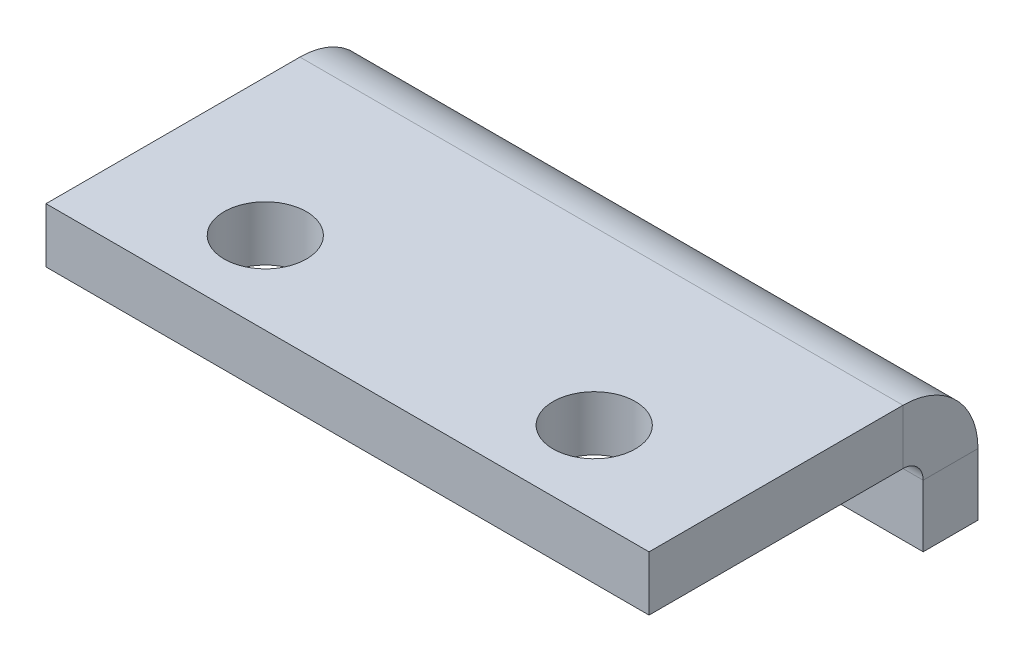
ISO-10303-21;
HEADER;
FILE_DESCRIPTION(('STEP AP214'),'2;1');
FILE_NAME('part.step','',(''),(''),'','','');
FILE_SCHEMA(('AUTOMOTIVE_DESIGN { 1 0 10303 214 1 1 1 1 }'));
ENDSEC;
DATA;
#1=APPLICATION_CONTEXT('core data for automotive mechanical design processes');
#2=APPLICATION_PROTOCOL_DEFINITION('international standard','automotive_design',2000,#1);
#3=PRODUCT_CONTEXT('',#1,'mechanical');
#4=PRODUCT('Part','Part','',(#3));
#5=PRODUCT_RELATED_PRODUCT_CATEGORY('part','',(#4));
#6=PRODUCT_DEFINITION_FORMATION('','',#4);
#7=PRODUCT_DEFINITION_CONTEXT('part definition',#1,'design');
#8=PRODUCT_DEFINITION('design','',#6,#7);
#9=PRODUCT_DEFINITION_SHAPE('','',#8);
#10=(LENGTH_UNIT() NAMED_UNIT(*) SI_UNIT(.MILLI.,.METRE.));
#11=(NAMED_UNIT(*) PLANE_ANGLE_UNIT() SI_UNIT($,.RADIAN.));
#12=(NAMED_UNIT(*) SI_UNIT($,.STERADIAN.) SOLID_ANGLE_UNIT());
#13=UNCERTAINTY_MEASURE_WITH_UNIT(LENGTH_MEASURE(1.E-05),#10,'distance_accuracy_value','');
#14=(GEOMETRIC_REPRESENTATION_CONTEXT(3) GLOBAL_UNCERTAINTY_ASSIGNED_CONTEXT((#13)) GLOBAL_UNIT_ASSIGNED_CONTEXT((#10,
#11,#12)) REPRESENTATION_CONTEXT('',''));
#15=CARTESIAN_POINT('',(0.,0.,0.));
#16=DIRECTION('',(0.,0.,1.));
#17=DIRECTION('',(1.,0.,0.));
#18=AXIS2_PLACEMENT_3D('',#15,#16,#17);
#19=CARTESIAN_POINT('',(11.,-2.,0.));
#20=DIRECTION('',(0.,1.,0.));
#21=DIRECTION('',(0.,0.,1.));
#22=AXIS2_PLACEMENT_3D('',#19,#20,#21);
#23=PLANE('',#22);
#24=CARTESIAN_POINT('',(-6.,-2.,-3.));
#25=DIRECTION('',(0.,1.,0.));
#26=DIRECTION('',(0.,0.,1.));
#27=AXIS2_PLACEMENT_3D('',#24,#25,#26);
#28=CIRCLE('',#27,1.5);
#29=CARTESIAN_POINT('',(-6.,-2.,-1.5));
#30=VERTEX_POINT('',#29);
#31=EDGE_CURVE('E195',#30,#30,#28,.T.);
#32=ORIENTED_EDGE('',*,*,#31,.T.);
#33=EDGE_LOOP('',(#32));
#34=FACE_BOUND('',#33,.T.);
#35=CARTESIAN_POINT('',(6.,-2.,-3.));
#36=DIRECTION('',(0.,1.,0.));
#37=DIRECTION('',(0.,0.,1.));
#38=AXIS2_PLACEMENT_3D('',#35,#36,#37);
#39=CIRCLE('',#38,1.5);
#40=CARTESIAN_POINT('',(6.,-2.,-1.5));
#41=VERTEX_POINT('',#40);
#42=EDGE_CURVE('E189',#41,#41,#39,.T.);
#43=ORIENTED_EDGE('',*,*,#42,.T.);
#44=EDGE_LOOP('',(#43));
#45=FACE_BOUND('',#44,.T.);
#46=DIRECTION('',(1.,0.,0.));
#47=VECTOR('',#46,1.);
#48=CARTESIAN_POINT('',(11.,-2.,-9.2634));
#49=LINE('',#48,#47);
#50=CARTESIAN_POINT('',(11.,-2.,-9.2634));
#51=VERTEX_POINT('',#50);
#52=CARTESIAN_POINT('',(-11.,-2.,-9.2634));
#53=VERTEX_POINT('',#52);
#54=EDGE_CURVE('E180',#51,#53,#49,.F.);
#55=ORIENTED_EDGE('',*,*,#54,.F.);
#56=DIRECTION('',(0.,0.,-1.));
#57=VECTOR('',#56,1.);
#58=CARTESIAN_POINT('',(11.,-2.,0.));
#59=LINE('',#58,#57);
#60=CARTESIAN_POINT('',(11.,-2.,0.));
#61=VERTEX_POINT('',#60);
#62=EDGE_CURVE('E199',#61,#51,#59,.T.);
#63=ORIENTED_EDGE('',*,*,#62,.F.);
#64=DIRECTION('',(-1.,0.,0.));
#65=VECTOR('',#64,1.);
#66=CARTESIAN_POINT('',(11.,-2.,0.));
#67=LINE('',#66,#65);
#68=CARTESIAN_POINT('',(-11.,-2.,0.));
#69=VERTEX_POINT('',#68);
#70=EDGE_CURVE('E67',#61,#69,#67,.T.);
#71=ORIENTED_EDGE('',*,*,#70,.T.);
#72=DIRECTION('',(0.,0.,-1.));
#73=VECTOR('',#72,1.);
#74=CARTESIAN_POINT('',(-11.,-2.,0.));
#75=LINE('',#74,#73);
#76=EDGE_CURVE('E198',#69,#53,#75,.T.);
#77=ORIENTED_EDGE('',*,*,#76,.T.);
#78=EDGE_LOOP('',(#55,#63,#71,#77));
#79=FACE_BOUND('',#78,.T.);
#80=ADVANCED_FACE('F59',(#34,#45,#79),#23,.F.);
#81=CARTESIAN_POINT('',(11.,0.,0.));
#82=DIRECTION('',(0.,1.,0.));
#83=DIRECTION('',(0.,0.,1.));
#84=AXIS2_PLACEMENT_3D('',#81,#82,#83);
#85=PLANE('',#84);
#86=CARTESIAN_POINT('',(6.,0.,-3.));
#87=DIRECTION('',(0.,1.,0.));
#88=DIRECTION('',(0.,0.,1.));
#89=AXIS2_PLACEMENT_3D('',#86,#87,#88);
#90=CIRCLE('',#89,1.5);
#91=CARTESIAN_POINT('',(6.,0.,-1.5));
#92=VERTEX_POINT('',#91);
#93=EDGE_CURVE('E185',#92,#92,#90,.T.);
#94=ORIENTED_EDGE('',*,*,#93,.F.);
#95=EDGE_LOOP('',(#94));
#96=FACE_BOUND('',#95,.T.);
#97=CARTESIAN_POINT('',(-6.,0.,-3.));
#98=DIRECTION('',(0.,1.,0.));
#99=DIRECTION('',(0.,0.,1.));
#100=AXIS2_PLACEMENT_3D('',#97,#98,#99);
#101=CIRCLE('',#100,1.5);
#102=CARTESIAN_POINT('',(-6.,0.,-1.5));
#103=VERTEX_POINT('',#102);
#104=EDGE_CURVE('E192',#103,#103,#101,.T.);
#105=ORIENTED_EDGE('',*,*,#104,.F.);
#106=EDGE_LOOP('',(#105));
#107=FACE_BOUND('',#106,.T.);
#108=DIRECTION('',(0.,0.,-1.));
#109=VECTOR('',#108,1.);
#110=CARTESIAN_POINT('',(11.,0.,0.));
#111=LINE('',#110,#109);
#112=CARTESIAN_POINT('',(11.,0.,0.));
#113=VERTEX_POINT('',#112);
#114=CARTESIAN_POINT('',(11.,0.,-9.2634));
#115=VERTEX_POINT('',#114);
#116=EDGE_CURVE('E202',#113,#115,#111,.T.);
#117=ORIENTED_EDGE('',*,*,#116,.T.);
#118=DIRECTION('',(1.,0.,0.));
#119=VECTOR('',#118,1.);
#120=CARTESIAN_POINT('',(11.,0.,-9.2634));
#121=LINE('',#120,#119);
#122=CARTESIAN_POINT('',(-11.,0.,-9.2634));
#123=VERTEX_POINT('',#122);
#124=EDGE_CURVE('E127',#115,#123,#121,.F.);
#125=ORIENTED_EDGE('',*,*,#124,.T.);
#126=DIRECTION('',(0.,0.,-1.));
#127=VECTOR('',#126,1.);
#128=CARTESIAN_POINT('',(-11.,0.,0.));
#129=LINE('',#128,#127);
#130=CARTESIAN_POINT('',(-11.,0.,0.));
#131=VERTEX_POINT('',#130);
#132=EDGE_CURVE('E210',#131,#123,#129,.T.);
#133=ORIENTED_EDGE('',*,*,#132,.F.);
#134=DIRECTION('',(-1.,0.,0.));
#135=VECTOR('',#134,1.);
#136=CARTESIAN_POINT('',(11.,0.,0.));
#137=LINE('',#136,#135);
#138=EDGE_CURVE('E13',#113,#131,#137,.T.);
#139=ORIENTED_EDGE('',*,*,#138,.F.);
#140=EDGE_LOOP('',(#117,#125,#133,#139));
#141=FACE_BOUND('',#140,.T.);
#142=ADVANCED_FACE('F232',(#96,#107,#141),#85,.T.);
#143=CARTESIAN_POINT('',(11.,-2.,-12.));
#144=DIRECTION('',(-1.,0.,0.));
#145=DIRECTION('',(0.,0.,1.));
#146=AXIS2_PLACEMENT_3D('',#143,#144,#145);
#147=PLANE('',#146);
#148=DIRECTION('',(0.,1.,0.));
#149=VECTOR('',#148,1.);
#150=CARTESIAN_POINT('',(11.,-2.,-9.2634));
#151=LINE('',#150,#149);
#152=EDGE_CURVE('E176',#51,#115,#151,.T.);
#153=ORIENTED_EDGE('',*,*,#152,.T.);
#154=ORIENTED_EDGE('',*,*,#116,.F.);
#155=DIRECTION('',(0.,1.,0.));
#156=VECTOR('',#155,1.);
#157=CARTESIAN_POINT('',(11.,-2.,0.));
#158=LINE('',#157,#156);
#159=EDGE_CURVE('E206',#61,#113,#158,.T.);
#160=ORIENTED_EDGE('',*,*,#159,.F.);
#161=ORIENTED_EDGE('',*,*,#62,.T.);
#162=EDGE_LOOP('',(#153,#154,#160,#161));
#163=FACE_BOUND('',#162,.T.);
#164=ADVANCED_FACE('F223',(#163),#147,.F.);
#165=CARTESIAN_POINT('',(11.,-2.,0.));
#166=DIRECTION('',(0.,0.,1.));
#167=DIRECTION('',(1.,0.,0.));
#168=AXIS2_PLACEMENT_3D('',#165,#166,#167);
#169=PLANE('',#168);
#170=DIRECTION('',(0.,1.,0.));
#171=VECTOR('',#170,1.);
#172=CARTESIAN_POINT('',(-11.,-2.,0.));
#173=LINE('',#172,#171);
#174=EDGE_CURVE('E203',#69,#131,#173,.T.);
#175=ORIENTED_EDGE('',*,*,#174,.F.);
#176=ORIENTED_EDGE('',*,*,#70,.F.);
#177=ORIENTED_EDGE('',*,*,#159,.T.);
#178=ORIENTED_EDGE('',*,*,#138,.T.);
#179=EDGE_LOOP('',(#175,#176,#177,#178));
#180=FACE_BOUND('',#179,.T.);
#181=ADVANCED_FACE('F221',(#180),#169,.T.);
#182=CARTESIAN_POINT('',(-11.,-2.,-12.));
#183=DIRECTION('',(-1.,0.,0.));
#184=DIRECTION('',(0.,0.,1.));
#185=AXIS2_PLACEMENT_3D('',#182,#183,#184);
#186=PLANE('',#185);
#187=DIRECTION('',(0.,1.,0.));
#188=VECTOR('',#187,1.);
#189=CARTESIAN_POINT('',(-11.,-2.,-9.2634));
#190=LINE('',#189,#188);
#191=EDGE_CURVE('E183',#53,#123,#190,.T.);
#192=ORIENTED_EDGE('',*,*,#191,.F.);
#193=ORIENTED_EDGE('',*,*,#76,.F.);
#194=ORIENTED_EDGE('',*,*,#174,.T.);
#195=ORIENTED_EDGE('',*,*,#132,.T.);
#196=EDGE_LOOP('',(#192,#193,#194,#195));
#197=FACE_BOUND('',#196,.T.);
#198=ADVANCED_FACE('F220',(#197),#186,.T.);
#199=CARTESIAN_POINT('',(-6.,-10.,-3.));
#200=DIRECTION('',(0.,1.,0.));
#201=DIRECTION('',(0.,0.,1.));
#202=AXIS2_PLACEMENT_3D('',#199,#200,#201);
#203=CYLINDRICAL_SURFACE('',#202,1.5);
#204=ORIENTED_EDGE('',*,*,#104,.T.);
#205=EDGE_LOOP('',(#204));
#206=FACE_BOUND('',#205,.T.);
#207=ORIENTED_EDGE('',*,*,#31,.F.);
#208=EDGE_LOOP('',(#207));
#209=FACE_BOUND('',#208,.T.);
#210=ADVANCED_FACE('F229',(#206,#209),#203,.F.);
#211=CARTESIAN_POINT('',(6.,-10.,-3.));
#212=DIRECTION('',(0.,1.,0.));
#213=DIRECTION('',(0.,0.,1.));
#214=AXIS2_PLACEMENT_3D('',#211,#212,#213);
#215=CYLINDRICAL_SURFACE('',#214,1.5);
#216=ORIENTED_EDGE('',*,*,#93,.T.);
#217=EDGE_LOOP('',(#216));
#218=FACE_BOUND('',#217,.T.);
#219=ORIENTED_EDGE('',*,*,#42,.F.);
#220=EDGE_LOOP('',(#219));
#221=FACE_BOUND('',#220,.T.);
#222=ADVANCED_FACE('F246',(#218,#221),#215,.F.);
#223=CARTESIAN_POINT('',(-11.,-2.7366,-9.2634));
#224=DIRECTION('',(-1.,0.,0.));
#225=DIRECTION('',(0.,0.,1.));
#226=AXIS2_PLACEMENT_3D('',#223,#224,#225);
#227=PLANE('',#226);
#228=DIRECTION('',(0.,0.,-1.));
#229=VECTOR('',#228,1.);
#230=CARTESIAN_POINT('',(-11.,-2.73659999999998,-12.));
#231=LINE('',#230,#229);
#232=CARTESIAN_POINT('',(-11.,-2.7366,-10.));
#233=VERTEX_POINT('',#232);
#234=CARTESIAN_POINT('',(-11.,-2.73659999999999,-12.));
#235=VERTEX_POINT('',#234);
#236=EDGE_CURVE('E172',#233,#235,#231,.T.);
#237=ORIENTED_EDGE('',*,*,#236,.F.);
#238=CARTESIAN_POINT('',(-11.,-2.7366,-9.2634));
#239=DIRECTION('',(1.,0.,0.));
#240=DIRECTION('',(0.,0.,-1.));
#241=AXIS2_PLACEMENT_3D('',#238,#239,#240);
#242=CIRCLE('',#241,0.7366);
#243=EDGE_CURVE('E130',#53,#233,#242,.F.);
#244=ORIENTED_EDGE('',*,*,#243,.F.);
#245=ORIENTED_EDGE('',*,*,#191,.T.);
#246=CARTESIAN_POINT('',(-11.,-2.7366,-9.2634));
#247=DIRECTION('',(1.,0.,0.));
#248=DIRECTION('',(0.,0.,-1.));
#249=AXIS2_PLACEMENT_3D('',#246,#247,#248);
#250=CIRCLE('',#249,2.7366);
#251=EDGE_CURVE('E88',#123,#235,#250,.F.);
#252=ORIENTED_EDGE('',*,*,#251,.T.);
#253=EDGE_LOOP('',(#237,#244,#245,#252));
#254=FACE_BOUND('',#253,.T.);
#255=ADVANCED_FACE('F248',(#254),#227,.T.);
#256=CARTESIAN_POINT('',(11.,-2.7366,-9.2634));
#257=DIRECTION('',(-1.,0.,0.));
#258=DIRECTION('',(0.,0.,1.));
#259=AXIS2_PLACEMENT_3D('',#256,#257,#258);
#260=PLANE('',#259);
#261=CARTESIAN_POINT('',(11.,-2.7366,-9.2634));
#262=DIRECTION('',(1.,0.,0.));
#263=DIRECTION('',(0.,0.,-1.));
#264=AXIS2_PLACEMENT_3D('',#261,#262,#263);
#265=CIRCLE('',#264,0.7366);
#266=CARTESIAN_POINT('',(11.,-2.7366,-10.));
#267=VERTEX_POINT('',#266);
#268=EDGE_CURVE('E137',#267,#51,#265,.T.);
#269=ORIENTED_EDGE('',*,*,#268,.F.);
#270=DIRECTION('',(0.,0.,-1.));
#271=VECTOR('',#270,1.);
#272=CARTESIAN_POINT('',(11.,-2.7366,-10.));
#273=LINE('',#272,#271);
#274=CARTESIAN_POINT('',(11.,-2.73659999999998,-12.));
#275=VERTEX_POINT('',#274);
#276=EDGE_CURVE('E134',#267,#275,#273,.T.);
#277=ORIENTED_EDGE('',*,*,#276,.T.);
#278=CARTESIAN_POINT('',(11.,-2.7366,-9.2634));
#279=DIRECTION('',(1.,0.,0.));
#280=DIRECTION('',(0.,0.,-1.));
#281=AXIS2_PLACEMENT_3D('',#278,#279,#280);
#282=CIRCLE('',#281,2.7366);
#283=EDGE_CURVE('E121',#275,#115,#282,.T.);
#284=ORIENTED_EDGE('',*,*,#283,.T.);
#285=ORIENTED_EDGE('',*,*,#152,.F.);
#286=EDGE_LOOP('',(#269,#277,#284,#285));
#287=FACE_BOUND('',#286,.T.);
#288=ADVANCED_FACE('F135',(#287),#260,.F.);
#289=CARTESIAN_POINT('',(11.,-2.7366,-9.2634));
#290=DIRECTION('',(1.,0.,0.));
#291=DIRECTION('',(0.,0.,-1.));
#292=AXIS2_PLACEMENT_3D('',#289,#290,#291);
#293=CYLINDRICAL_SURFACE('',#292,2.7366);
#294=ORIENTED_EDGE('',*,*,#124,.F.);
#295=ORIENTED_EDGE('',*,*,#283,.F.);
#296=DIRECTION('',(1.,0.,0.));
#297=VECTOR('',#296,1.);
#298=CARTESIAN_POINT('',(0.,-2.73659999999998,-12.));
#299=LINE('',#298,#297);
#300=EDGE_CURVE('E125',#235,#275,#299,.T.);
#301=ORIENTED_EDGE('',*,*,#300,.F.);
#302=ORIENTED_EDGE('',*,*,#251,.F.);
#303=EDGE_LOOP('',(#294,#295,#301,#302));
#304=FACE_BOUND('',#303,.T.);
#305=ADVANCED_FACE('F123',(#304),#293,.T.);
#306=CARTESIAN_POINT('',(11.,-2.7366,-9.2634));
#307=DIRECTION('',(1.,0.,0.));
#308=DIRECTION('',(0.,0.,-1.));
#309=AXIS2_PLACEMENT_3D('',#306,#307,#308);
#310=CYLINDRICAL_SURFACE('',#309,0.7366);
#311=ORIENTED_EDGE('',*,*,#54,.T.);
#312=ORIENTED_EDGE('',*,*,#243,.T.);
#313=DIRECTION('',(-1.,0.,0.));
#314=VECTOR('',#313,1.);
#315=CARTESIAN_POINT('',(-11.,-2.7366,-10.));
#316=LINE('',#315,#314);
#317=EDGE_CURVE('E142',#233,#267,#316,.F.);
#318=ORIENTED_EDGE('',*,*,#317,.T.);
#319=ORIENTED_EDGE('',*,*,#268,.T.);
#320=EDGE_LOOP('',(#311,#312,#318,#319));
#321=FACE_BOUND('',#320,.T.);
#322=ADVANCED_FACE('F262',(#321),#310,.F.);
#323=CARTESIAN_POINT('',(11.,-1.99999999999999,-12.));
#324=DIRECTION('',(1.,0.,0.));
#325=DIRECTION('',(0.,0.,-1.));
#326=AXIS2_PLACEMENT_3D('',#323,#324,#325);
#327=PLANE('',#326);
#328=DIRECTION('',(0.,1.,0.));
#329=VECTOR('',#328,1.);
#330=CARTESIAN_POINT('',(11.,-1.99999999999999,-12.));
#331=LINE('',#330,#329);
#332=CARTESIAN_POINT('',(11.,-5.,-12.));
#333=VERTEX_POINT('',#332);
#334=EDGE_CURVE('E149',#333,#275,#331,.T.);
#335=ORIENTED_EDGE('',*,*,#334,.T.);
#336=ORIENTED_EDGE('',*,*,#276,.F.);
#337=DIRECTION('',(0.,-1.,0.));
#338=VECTOR('',#337,1.);
#339=CARTESIAN_POINT('',(11.,0.,-9.99999999999999));
#340=LINE('',#339,#338);
#341=CARTESIAN_POINT('',(11.,-5.00000000000001,-10.));
#342=VERTEX_POINT('',#341);
#343=EDGE_CURVE('E165',#342,#267,#340,.F.);
#344=ORIENTED_EDGE('',*,*,#343,.F.);
#345=DIRECTION('',(0.,0.,1.));
#346=VECTOR('',#345,1.);
#347=CARTESIAN_POINT('',(11.,-5.,-12.));
#348=LINE('',#347,#346);
#349=EDGE_CURVE('E154',#333,#342,#348,.T.);
#350=ORIENTED_EDGE('',*,*,#349,.F.);
#351=EDGE_LOOP('',(#335,#336,#344,#350));
#352=FACE_BOUND('',#351,.T.);
#353=ADVANCED_FACE('F153',(#352),#327,.T.);
#354=CARTESIAN_POINT('',(-11.,-5.,-12.));
#355=DIRECTION('',(-1.,0.,0.));
#356=DIRECTION('',(0.,0.,1.));
#357=AXIS2_PLACEMENT_3D('',#354,#355,#356);
#358=PLANE('',#357);
#359=DIRECTION('',(0.,1.,0.));
#360=VECTOR('',#359,1.);
#361=CARTESIAN_POINT('',(-11.,0.,-9.99999999999999));
#362=LINE('',#361,#360);
#363=CARTESIAN_POINT('',(-11.,-5.00000000000001,-10.));
#364=VERTEX_POINT('',#363);
#365=EDGE_CURVE('E151',#233,#364,#362,.F.);
#366=ORIENTED_EDGE('',*,*,#365,.F.);
#367=ORIENTED_EDGE('',*,*,#236,.T.);
#368=DIRECTION('',(0.,-1.,0.));
#369=VECTOR('',#368,1.);
#370=CARTESIAN_POINT('',(-11.,-5.,-12.));
#371=LINE('',#370,#369);
#372=CARTESIAN_POINT('',(-11.,-5.,-12.));
#373=VERTEX_POINT('',#372);
#374=EDGE_CURVE('E150',#235,#373,#371,.T.);
#375=ORIENTED_EDGE('',*,*,#374,.T.);
#376=DIRECTION('',(0.,0.,1.));
#377=VECTOR('',#376,1.);
#378=CARTESIAN_POINT('',(-11.,-5.,-12.));
#379=LINE('',#378,#377);
#380=EDGE_CURVE('E156',#373,#364,#379,.T.);
#381=ORIENTED_EDGE('',*,*,#380,.T.);
#382=EDGE_LOOP('',(#366,#367,#375,#381));
#383=FACE_BOUND('',#382,.T.);
#384=ADVANCED_FACE('F268',(#383),#358,.T.);
#385=CARTESIAN_POINT('',(0.,0.,-12.));
#386=DIRECTION('',(0.,0.,-1.));
#387=DIRECTION('',(0.,1.,0.));
#388=AXIS2_PLACEMENT_3D('',#385,#386,#387);
#389=PLANE('',#388);
#390=ORIENTED_EDGE('',*,*,#374,.F.);
#391=ORIENTED_EDGE('',*,*,#300,.T.);
#392=ORIENTED_EDGE('',*,*,#334,.F.);
#393=DIRECTION('',(1.,0.,0.));
#394=VECTOR('',#393,1.);
#395=CARTESIAN_POINT('',(11.,-5.,-12.));
#396=LINE('',#395,#394);
#397=EDGE_CURVE('E157',#373,#333,#396,.T.);
#398=ORIENTED_EDGE('',*,*,#397,.F.);
#399=EDGE_LOOP('',(#390,#391,#392,#398));
#400=FACE_BOUND('',#399,.T.);
#401=ADVANCED_FACE('F147',(#400),#389,.T.);
#402=CARTESIAN_POINT('',(0.,0.,-9.99999999999999));
#403=DIRECTION('',(0.,0.,-1.));
#404=DIRECTION('',(0.,1.,0.));
#405=AXIS2_PLACEMENT_3D('',#402,#403,#404);
#406=PLANE('',#405);
#407=ORIENTED_EDGE('',*,*,#317,.F.);
#408=ORIENTED_EDGE('',*,*,#365,.T.);
#409=DIRECTION('',(-1.,0.,0.));
#410=VECTOR('',#409,1.);
#411=CARTESIAN_POINT('',(0.,-5.00000000000001,-10.));
#412=LINE('',#411,#410);
#413=EDGE_CURVE('E167',#364,#342,#412,.F.);
#414=ORIENTED_EDGE('',*,*,#413,.T.);
#415=ORIENTED_EDGE('',*,*,#343,.T.);
#416=EDGE_LOOP('',(#407,#408,#414,#415));
#417=FACE_BOUND('',#416,.T.);
#418=ADVANCED_FACE('F275',(#417),#406,.F.);
#419=CARTESIAN_POINT('',(11.,-5.,-12.));
#420=DIRECTION('',(0.,-1.,0.));
#421=DIRECTION('',(0.,0.,-1.));
#422=AXIS2_PLACEMENT_3D('',#419,#420,#421);
#423=PLANE('',#422);
#424=ORIENTED_EDGE('',*,*,#413,.F.);
#425=ORIENTED_EDGE('',*,*,#380,.F.);
#426=ORIENTED_EDGE('',*,*,#397,.T.);
#427=ORIENTED_EDGE('',*,*,#349,.T.);
#428=EDGE_LOOP('',(#424,#425,#426,#427));
#429=FACE_BOUND('',#428,.T.);
#430=ADVANCED_FACE('F272',(#429),#423,.T.);
#431=CLOSED_SHELL('',(#80,#142,#164,#181,#198,#210,#222,#255,#288,#305,#322,#353,#384,#401,#418,#430));
#432=MANIFOLD_SOLID_BREP('B2',#431);
#433=ADVANCED_BREP_SHAPE_REPRESENTATION('',(#18,#432),#14);
#434=SHAPE_DEFINITION_REPRESENTATION(#9,#433);
ENDSEC;
END-ISO-10303-21;
